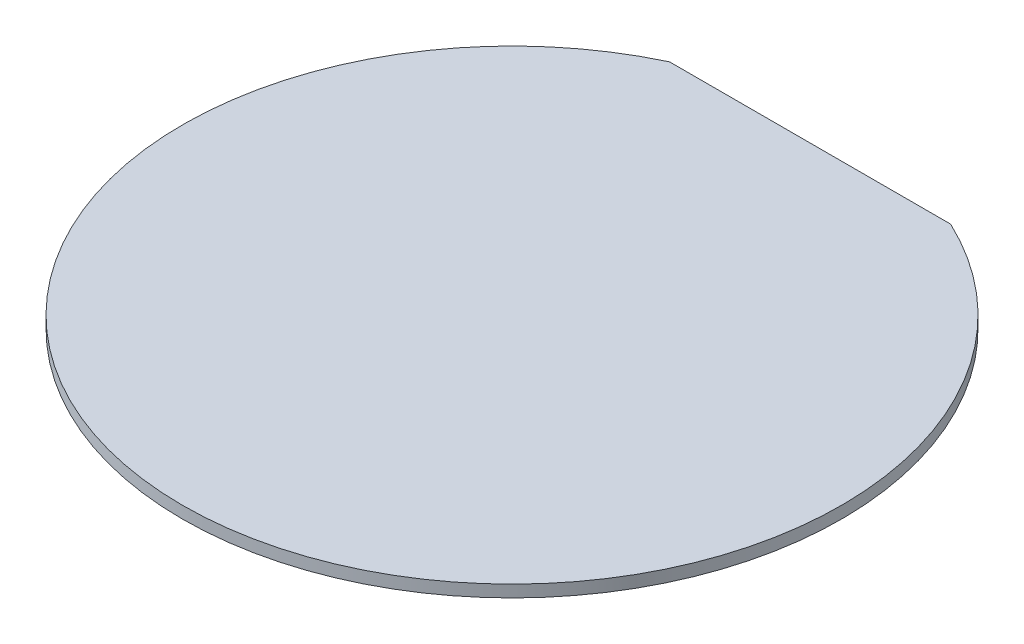
ISO-10303-21;
HEADER;
FILE_DESCRIPTION(('STEP AP214'),'2;1');
FILE_NAME('part.step','',(''),(''),'','','');
FILE_SCHEMA(('AUTOMOTIVE_DESIGN { 1 0 10303 214 1 1 1 1 }'));
ENDSEC;
DATA;
#1=APPLICATION_CONTEXT('core data for automotive mechanical design processes');
#2=APPLICATION_PROTOCOL_DEFINITION('international standard','automotive_design',2000,#1);
#3=PRODUCT_CONTEXT('',#1,'mechanical');
#4=PRODUCT('Part','Part','',(#3));
#5=PRODUCT_RELATED_PRODUCT_CATEGORY('part','',(#4));
#6=PRODUCT_DEFINITION_FORMATION('','',#4);
#7=PRODUCT_DEFINITION_CONTEXT('part definition',#1,'design');
#8=PRODUCT_DEFINITION('design','',#6,#7);
#9=PRODUCT_DEFINITION_SHAPE('','',#8);
#10=(LENGTH_UNIT() NAMED_UNIT(*) SI_UNIT(.MILLI.,.METRE.));
#11=(NAMED_UNIT(*) PLANE_ANGLE_UNIT() SI_UNIT($,.RADIAN.));
#12=(NAMED_UNIT(*) SI_UNIT($,.STERADIAN.) SOLID_ANGLE_UNIT());
#13=UNCERTAINTY_MEASURE_WITH_UNIT(LENGTH_MEASURE(1.E-05),#10,'distance_accuracy_value','');
#14=(GEOMETRIC_REPRESENTATION_CONTEXT(3) GLOBAL_UNCERTAINTY_ASSIGNED_CONTEXT((#13)) GLOBAL_UNIT_ASSIGNED_CONTEXT((#10,
#11,#12)) REPRESENTATION_CONTEXT('',''));
#15=CARTESIAN_POINT('',(0.,0.,0.));
#16=DIRECTION('',(0.,0.,1.));
#17=DIRECTION('',(1.,0.,0.));
#18=AXIS2_PLACEMENT_3D('',#15,#16,#17);
#19=CARTESIAN_POINT('',(9.67530852697313,1.,-3.48411797111857));
#20=DIRECTION('',(0.,-1.,0.));
#21=DIRECTION('',(0.,0.,-1.));
#22=AXIS2_PLACEMENT_3D('',#19,#20,#21);
#23=CYLINDRICAL_SURFACE('',#22,27.506);
#24=CARTESIAN_POINT('',(9.67530852697313,0.,-3.48411797111857));
#25=DIRECTION('',(0.,1.,0.));
#26=DIRECTION('',(0.,0.,1.));
#27=AXIS2_PLACEMENT_3D('',#24,#25,#26);
#28=CIRCLE('',#27,27.506);
#29=CARTESIAN_POINT('',(-2.05443573107013,0.,-28.3636906290422));
#30=VERTEX_POINT('',#29);
#31=CARTESIAN_POINT('',(21.4050527850164,0.,-28.3636906290422));
#32=VERTEX_POINT('',#31);
#33=EDGE_CURVE('E65',#30,#32,#28,.T.);
#34=ORIENTED_EDGE('',*,*,#33,.T.);
#35=DIRECTION('',(0.,-1.,0.));
#36=VECTOR('',#35,1.);
#37=CARTESIAN_POINT('',(21.4050527850164,1.,-28.3636906290422));
#38=LINE('',#37,#36);
#39=CARTESIAN_POINT('',(21.4050527850164,1.,-28.3636906290422));
#40=VERTEX_POINT('',#39);
#41=EDGE_CURVE('E11',#40,#32,#38,.T.);
#42=ORIENTED_EDGE('',*,*,#41,.F.);
#43=CARTESIAN_POINT('',(9.67530852697313,1.,-3.48411797111857));
#44=DIRECTION('',(0.,1.,0.));
#45=DIRECTION('',(0.,0.,1.));
#46=AXIS2_PLACEMENT_3D('',#43,#44,#45);
#47=CIRCLE('',#46,27.506);
#48=CARTESIAN_POINT('',(-2.05443573107013,1.,-28.3636906290422));
#49=VERTEX_POINT('',#48);
#50=EDGE_CURVE('E64',#49,#40,#47,.T.);
#51=ORIENTED_EDGE('',*,*,#50,.F.);
#52=DIRECTION('',(0.,-1.,0.));
#53=VECTOR('',#52,1.);
#54=CARTESIAN_POINT('',(-2.05443573107013,1.,-28.3636906290422));
#55=LINE('',#54,#53);
#56=EDGE_CURVE('E42',#49,#30,#55,.T.);
#57=ORIENTED_EDGE('',*,*,#56,.T.);
#58=EDGE_LOOP('',(#34,#42,#51,#57));
#59=FACE_BOUND('',#58,.T.);
#60=ADVANCED_FACE('F34',(#59),#23,.T.);
#61=CARTESIAN_POINT('',(21.4050527850164,1.,-28.3636906290422));
#62=DIRECTION('',(0.,0.,1.));
#63=DIRECTION('',(1.,0.,0.));
#64=AXIS2_PLACEMENT_3D('',#61,#62,#63);
#65=PLANE('',#64);
#66=DIRECTION('',(-1.,0.,0.));
#67=VECTOR('',#66,1.);
#68=CARTESIAN_POINT('',(21.4050527850164,0.,-28.3636906290422));
#69=LINE('',#68,#67);
#70=EDGE_CURVE('E57',#32,#30,#69,.T.);
#71=ORIENTED_EDGE('',*,*,#70,.T.);
#72=ORIENTED_EDGE('',*,*,#56,.F.);
#73=DIRECTION('',(-1.,0.,0.));
#74=VECTOR('',#73,1.);
#75=CARTESIAN_POINT('',(21.4050527850164,1.,-28.3636906290422));
#76=LINE('',#75,#74);
#77=EDGE_CURVE('E49',#40,#49,#76,.T.);
#78=ORIENTED_EDGE('',*,*,#77,.F.);
#79=ORIENTED_EDGE('',*,*,#41,.T.);
#80=EDGE_LOOP('',(#71,#72,#78,#79));
#81=FACE_BOUND('',#80,.T.);
#82=ADVANCED_FACE('F60',(#81),#65,.F.);
#83=CARTESIAN_POINT('',(9.67530852697313,1.,-3.48411797111857));
#84=DIRECTION('',(0.,1.,0.));
#85=DIRECTION('',(0.,0.,1.));
#86=AXIS2_PLACEMENT_3D('',#83,#84,#85);
#87=PLANE('',#86);
#88=ORIENTED_EDGE('',*,*,#50,.T.);
#89=ORIENTED_EDGE('',*,*,#77,.T.);
#90=EDGE_LOOP('',(#88,#89));
#91=FACE_BOUND('',#90,.T.);
#92=ADVANCED_FACE('F72',(#91),#87,.T.);
#93=CARTESIAN_POINT('',(9.67530852697313,0.,-3.48411797111857));
#94=DIRECTION('',(0.,1.,0.));
#95=DIRECTION('',(0.,0.,1.));
#96=AXIS2_PLACEMENT_3D('',#93,#94,#95);
#97=PLANE('',#96);
#98=ORIENTED_EDGE('',*,*,#33,.F.);
#99=ORIENTED_EDGE('',*,*,#70,.F.);
#100=EDGE_LOOP('',(#98,#99));
#101=FACE_BOUND('',#100,.T.);
#102=ADVANCED_FACE('F68',(#101),#97,.F.);
#103=CLOSED_SHELL('',(#60,#82,#92,#102));
#104=MANIFOLD_SOLID_BREP('B2',#103);
#105=ADVANCED_BREP_SHAPE_REPRESENTATION('',(#18,#104),#14);
#106=SHAPE_DEFINITION_REPRESENTATION(#9,#105);
ENDSEC;
END-ISO-10303-21;
